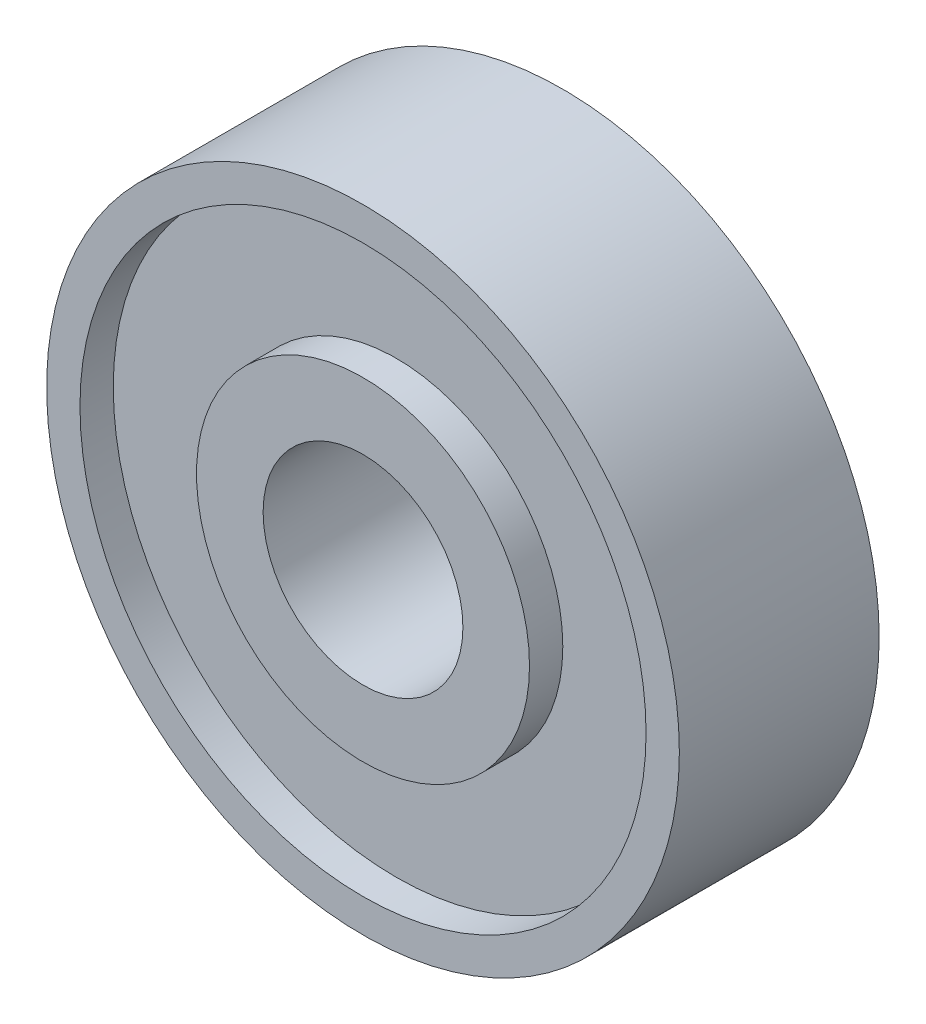
ISO-10303-21;
HEADER;
FILE_DESCRIPTION(('STEP AP214'),'2;1');
FILE_NAME('part.step','',(''),(''),'','','');
FILE_SCHEMA(('AUTOMOTIVE_DESIGN { 1 0 10303 214 1 1 1 1 }'));
ENDSEC;
DATA;
#1=APPLICATION_CONTEXT('core data for automotive mechanical design processes');
#2=APPLICATION_PROTOCOL_DEFINITION('international standard','automotive_design',2000,#1);
#3=PRODUCT_CONTEXT('',#1,'mechanical');
#4=PRODUCT('Part','Part','',(#3));
#5=PRODUCT_RELATED_PRODUCT_CATEGORY('part','',(#4));
#6=PRODUCT_DEFINITION_FORMATION('','',#4);
#7=PRODUCT_DEFINITION_CONTEXT('part definition',#1,'design');
#8=PRODUCT_DEFINITION('design','',#6,#7);
#9=PRODUCT_DEFINITION_SHAPE('','',#8);
#10=(LENGTH_UNIT() NAMED_UNIT(*) SI_UNIT(.MILLI.,.METRE.));
#11=(NAMED_UNIT(*) PLANE_ANGLE_UNIT() SI_UNIT($,.RADIAN.));
#12=(NAMED_UNIT(*) SI_UNIT($,.STERADIAN.) SOLID_ANGLE_UNIT());
#13=UNCERTAINTY_MEASURE_WITH_UNIT(LENGTH_MEASURE(1.E-05),#10,'distance_accuracy_value','');
#14=(GEOMETRIC_REPRESENTATION_CONTEXT(3) GLOBAL_UNCERTAINTY_ASSIGNED_CONTEXT((#13)) GLOBAL_UNIT_ASSIGNED_CONTEXT((#10,
#11,#12)) REPRESENTATION_CONTEXT('',''));
#15=CARTESIAN_POINT('',(0.,0.,0.));
#16=DIRECTION('',(0.,0.,1.));
#17=DIRECTION('',(1.,0.,0.));
#18=AXIS2_PLACEMENT_3D('',#15,#16,#17);
#19=CARTESIAN_POINT('',(0.,0.,1.));
#20=DIRECTION('',(0.,0.,-1.));
#21=DIRECTION('',(-1.,0.,0.));
#22=AXIS2_PLACEMENT_3D('',#19,#20,#21);
#23=PLANE('',#22);
#24=CARTESIAN_POINT('',(0.,0.,1.));
#25=DIRECTION('',(0.,0.,-1.));
#26=DIRECTION('',(-1.,0.,0.));
#27=AXIS2_PLACEMENT_3D('',#24,#25,#26);
#28=CIRCLE('',#27,8.5);
#29=CARTESIAN_POINT('',(-8.5,0.,1.));
#30=VERTEX_POINT('',#29);
#31=EDGE_CURVE('E46',#30,#30,#28,.T.);
#32=ORIENTED_EDGE('',*,*,#31,.T.);
#33=EDGE_LOOP('',(#32));
#34=FACE_BOUND('',#33,.T.);
#35=CARTESIAN_POINT('',(0.,0.,1.));
#36=DIRECTION('',(0.,0.,-1.));
#37=DIRECTION('',(-1.,0.,0.));
#38=AXIS2_PLACEMENT_3D('',#35,#36,#37);
#39=CIRCLE('',#38,5.);
#40=CARTESIAN_POINT('',(-5.,0.,1.));
#41=VERTEX_POINT('',#40);
#42=EDGE_CURVE('E61',#41,#41,#39,.T.);
#43=ORIENTED_EDGE('',*,*,#42,.F.);
#44=EDGE_LOOP('',(#43));
#45=FACE_BOUND('',#44,.T.);
#46=ADVANCED_FACE('F30',(#34,#45),#23,.T.);
#47=CARTESIAN_POINT('',(0.,0.,5.));
#48=DIRECTION('',(0.,0.,1.));
#49=DIRECTION('',(1.,0.,0.));
#50=AXIS2_PLACEMENT_3D('',#47,#48,#49);
#51=PLANE('',#50);
#52=CARTESIAN_POINT('',(0.,0.,5.));
#53=DIRECTION('',(0.,0.,1.));
#54=DIRECTION('',(1.,0.,0.));
#55=AXIS2_PLACEMENT_3D('',#52,#53,#54);
#56=CIRCLE('',#55,8.5);
#57=CARTESIAN_POINT('',(8.5,0.,5.));
#58=VERTEX_POINT('',#57);
#59=EDGE_CURVE('E41',#58,#58,#56,.T.);
#60=ORIENTED_EDGE('',*,*,#59,.T.);
#61=EDGE_LOOP('',(#60));
#62=FACE_BOUND('',#61,.T.);
#63=CARTESIAN_POINT('',(0.,0.,5.));
#64=DIRECTION('',(0.,0.,1.));
#65=DIRECTION('',(1.,0.,0.));
#66=AXIS2_PLACEMENT_3D('',#63,#64,#65);
#67=CIRCLE('',#66,5.);
#68=CARTESIAN_POINT('',(5.,0.,5.));
#69=VERTEX_POINT('',#68);
#70=EDGE_CURVE('E55',#69,#69,#67,.T.);
#71=ORIENTED_EDGE('',*,*,#70,.F.);
#72=EDGE_LOOP('',(#71));
#73=FACE_BOUND('',#72,.T.);
#74=ADVANCED_FACE('F96',(#62,#73),#51,.T.);
#75=CARTESIAN_POINT('',(0.,0.,6.));
#76=DIRECTION('',(0.,0.,-1.));
#77=DIRECTION('',(-1.,0.,0.));
#78=AXIS2_PLACEMENT_3D('',#75,#76,#77);
#79=CYLINDRICAL_SURFACE('',#78,9.5);
#80=CARTESIAN_POINT('',(0.,0.,6.));
#81=DIRECTION('',(0.,0.,1.));
#82=DIRECTION('',(1.,0.,0.));
#83=AXIS2_PLACEMENT_3D('',#80,#81,#82);
#84=CIRCLE('',#83,9.5);
#85=CARTESIAN_POINT('',(9.5,0.,6.));
#86=VERTEX_POINT('',#85);
#87=EDGE_CURVE('E10',#86,#86,#84,.T.);
#88=ORIENTED_EDGE('',*,*,#87,.F.);
#89=EDGE_LOOP('',(#88));
#90=FACE_BOUND('',#89,.T.);
#91=CARTESIAN_POINT('',(0.,0.,0.));
#92=DIRECTION('',(0.,0.,1.));
#93=DIRECTION('',(1.,0.,0.));
#94=AXIS2_PLACEMENT_3D('',#91,#92,#93);
#95=CIRCLE('',#94,9.5);
#96=CARTESIAN_POINT('',(9.5,0.,0.));
#97=VERTEX_POINT('',#96);
#98=EDGE_CURVE('E34',#97,#97,#95,.T.);
#99=ORIENTED_EDGE('',*,*,#98,.T.);
#100=EDGE_LOOP('',(#99));
#101=FACE_BOUND('',#100,.T.);
#102=ADVANCED_FACE('F32',(#90,#101),#79,.T.);
#103=CARTESIAN_POINT('',(0.,0.,6.));
#104=DIRECTION('',(0.,0.,1.));
#105=DIRECTION('',(1.,0.,0.));
#106=AXIS2_PLACEMENT_3D('',#103,#104,#105);
#107=PLANE('',#106);
#108=CARTESIAN_POINT('',(0.,0.,6.));
#109=DIRECTION('',(0.,0.,1.));
#110=DIRECTION('',(1.,0.,0.));
#111=AXIS2_PLACEMENT_3D('',#108,#109,#110);
#112=CIRCLE('',#111,8.5);
#113=CARTESIAN_POINT('',(8.5,0.,6.));
#114=VERTEX_POINT('',#113);
#115=EDGE_CURVE('E43',#114,#114,#112,.T.);
#116=ORIENTED_EDGE('',*,*,#115,.F.);
#117=EDGE_LOOP('',(#116));
#118=FACE_BOUND('',#117,.T.);
#119=ORIENTED_EDGE('',*,*,#87,.T.);
#120=EDGE_LOOP('',(#119));
#121=FACE_BOUND('',#120,.T.);
#122=ADVANCED_FACE('F104',(#118,#121),#107,.T.);
#123=CARTESIAN_POINT('',(0.,0.,0.));
#124=DIRECTION('',(0.,0.,1.));
#125=DIRECTION('',(1.,0.,0.));
#126=AXIS2_PLACEMENT_3D('',#123,#124,#125);
#127=PLANE('',#126);
#128=CARTESIAN_POINT('',(0.,0.,0.));
#129=DIRECTION('',(0.,0.,-1.));
#130=DIRECTION('',(-1.,0.,0.));
#131=AXIS2_PLACEMENT_3D('',#128,#129,#130);
#132=CIRCLE('',#131,8.5);
#133=CARTESIAN_POINT('',(-8.5,0.,0.));
#134=VERTEX_POINT('',#133);
#135=EDGE_CURVE('E49',#134,#134,#132,.T.);
#136=ORIENTED_EDGE('',*,*,#135,.F.);
#137=EDGE_LOOP('',(#136));
#138=FACE_BOUND('',#137,.T.);
#139=ORIENTED_EDGE('',*,*,#98,.F.);
#140=EDGE_LOOP('',(#139));
#141=FACE_BOUND('',#140,.T.);
#142=ADVANCED_FACE('F113',(#138,#141),#127,.F.);
#143=CARTESIAN_POINT('',(0.,0.,5.));
#144=DIRECTION('',(0.,0.,1.));
#145=DIRECTION('',(1.,0.,0.));
#146=AXIS2_PLACEMENT_3D('',#143,#144,#145);
#147=CYLINDRICAL_SURFACE('',#146,8.5);
#148=ORIENTED_EDGE('',*,*,#59,.F.);
#149=EDGE_LOOP('',(#148));
#150=FACE_BOUND('',#149,.T.);
#151=ORIENTED_EDGE('',*,*,#115,.T.);
#152=EDGE_LOOP('',(#151));
#153=FACE_BOUND('',#152,.T.);
#154=ADVANCED_FACE('F110',(#150,#153),#147,.F.);
#155=CARTESIAN_POINT('',(0.,0.,1.));
#156=DIRECTION('',(0.,0.,-1.));
#157=DIRECTION('',(-1.,0.,0.));
#158=AXIS2_PLACEMENT_3D('',#155,#156,#157);
#159=CYLINDRICAL_SURFACE('',#158,8.5);
#160=ORIENTED_EDGE('',*,*,#31,.F.);
#161=EDGE_LOOP('',(#160));
#162=FACE_BOUND('',#161,.T.);
#163=ORIENTED_EDGE('',*,*,#135,.T.);
#164=EDGE_LOOP('',(#163));
#165=FACE_BOUND('',#164,.T.);
#166=ADVANCED_FACE('F92',(#162,#165),#159,.F.);
#167=CARTESIAN_POINT('',(0.,0.,6.));
#168=DIRECTION('',(0.,0.,-1.));
#169=DIRECTION('',(-1.,0.,0.));
#170=AXIS2_PLACEMENT_3D('',#167,#168,#169);
#171=CYLINDRICAL_SURFACE('',#170,5.);
#172=CARTESIAN_POINT('',(0.,0.,6.));
#173=DIRECTION('',(0.,0.,1.));
#174=DIRECTION('',(1.,0.,0.));
#175=AXIS2_PLACEMENT_3D('',#172,#173,#174);
#176=CIRCLE('',#175,5.);
#177=CARTESIAN_POINT('',(5.,0.,6.));
#178=VERTEX_POINT('',#177);
#179=EDGE_CURVE('E52',#178,#178,#176,.T.);
#180=ORIENTED_EDGE('',*,*,#179,.F.);
#181=EDGE_LOOP('',(#180));
#182=FACE_BOUND('',#181,.T.);
#183=ORIENTED_EDGE('',*,*,#70,.T.);
#184=EDGE_LOOP('',(#183));
#185=FACE_BOUND('',#184,.T.);
#186=ADVANCED_FACE('F86',(#182,#185),#171,.T.);
#187=CARTESIAN_POINT('',(0.,0.,6.));
#188=DIRECTION('',(0.,0.,1.));
#189=DIRECTION('',(1.,0.,0.));
#190=AXIS2_PLACEMENT_3D('',#187,#188,#189);
#191=PLANE('',#190);
#192=CARTESIAN_POINT('',(0.,0.,6.));
#193=DIRECTION('',(0.,0.,1.));
#194=DIRECTION('',(1.,0.,0.));
#195=AXIS2_PLACEMENT_3D('',#192,#193,#194);
#196=CIRCLE('',#195,3.);
#197=CARTESIAN_POINT('',(3.,0.,6.));
#198=VERTEX_POINT('',#197);
#199=EDGE_CURVE('E67',#198,#198,#196,.T.);
#200=ORIENTED_EDGE('',*,*,#199,.F.);
#201=EDGE_LOOP('',(#200));
#202=FACE_BOUND('',#201,.T.);
#203=ORIENTED_EDGE('',*,*,#179,.T.);
#204=EDGE_LOOP('',(#203));
#205=FACE_BOUND('',#204,.T.);
#206=ADVANCED_FACE('F82',(#202,#205),#191,.T.);
#207=CARTESIAN_POINT('',(0.,0.,0.));
#208=DIRECTION('',(0.,0.,1.));
#209=DIRECTION('',(1.,0.,0.));
#210=AXIS2_PLACEMENT_3D('',#207,#208,#209);
#211=CYLINDRICAL_SURFACE('',#210,5.);
#212=CARTESIAN_POINT('',(0.,0.,0.));
#213=DIRECTION('',(0.,0.,-1.));
#214=DIRECTION('',(-1.,0.,0.));
#215=AXIS2_PLACEMENT_3D('',#212,#213,#214);
#216=CIRCLE('',#215,5.);
#217=CARTESIAN_POINT('',(-5.,0.,0.));
#218=VERTEX_POINT('',#217);
#219=EDGE_CURVE('E58',#218,#218,#216,.T.);
#220=ORIENTED_EDGE('',*,*,#219,.F.);
#221=EDGE_LOOP('',(#220));
#222=FACE_BOUND('',#221,.T.);
#223=ORIENTED_EDGE('',*,*,#42,.T.);
#224=EDGE_LOOP('',(#223));
#225=FACE_BOUND('',#224,.T.);
#226=ADVANCED_FACE('F85',(#222,#225),#211,.T.);
#227=CARTESIAN_POINT('',(0.,0.,0.));
#228=DIRECTION('',(0.,0.,-1.));
#229=DIRECTION('',(-1.,0.,0.));
#230=AXIS2_PLACEMENT_3D('',#227,#228,#229);
#231=PLANE('',#230);
#232=CARTESIAN_POINT('',(0.,0.,0.));
#233=DIRECTION('',(0.,0.,1.));
#234=DIRECTION('',(1.,0.,0.));
#235=AXIS2_PLACEMENT_3D('',#232,#233,#234);
#236=CIRCLE('',#235,3.);
#237=CARTESIAN_POINT('',(3.,0.,0.));
#238=VERTEX_POINT('',#237);
#239=EDGE_CURVE('E64',#238,#238,#236,.T.);
#240=ORIENTED_EDGE('',*,*,#239,.T.);
#241=EDGE_LOOP('',(#240));
#242=FACE_BOUND('',#241,.T.);
#243=ORIENTED_EDGE('',*,*,#219,.T.);
#244=EDGE_LOOP('',(#243));
#245=FACE_BOUND('',#244,.T.);
#246=ADVANCED_FACE('F73',(#242,#245),#231,.T.);
#247=CARTESIAN_POINT('',(0.,0.,0.));
#248=DIRECTION('',(0.,0.,1.));
#249=DIRECTION('',(1.,0.,0.));
#250=AXIS2_PLACEMENT_3D('',#247,#248,#249);
#251=CYLINDRICAL_SURFACE('',#250,3.);
#252=ORIENTED_EDGE('',*,*,#239,.F.);
#253=EDGE_LOOP('',(#252));
#254=FACE_BOUND('',#253,.T.);
#255=ORIENTED_EDGE('',*,*,#199,.T.);
#256=EDGE_LOOP('',(#255));
#257=FACE_BOUND('',#256,.T.);
#258=ADVANCED_FACE('F76',(#254,#257),#251,.F.);
#259=CLOSED_SHELL('',(#46,#74,#102,#122,#142,#154,#166,#186,#206,#226,#246,#258));
#260=MANIFOLD_SOLID_BREP('B2',#259);
#261=ADVANCED_BREP_SHAPE_REPRESENTATION('',(#18,#260),#14);
#262=SHAPE_DEFINITION_REPRESENTATION(#9,#261);
ENDSEC;
END-ISO-10303-21;
